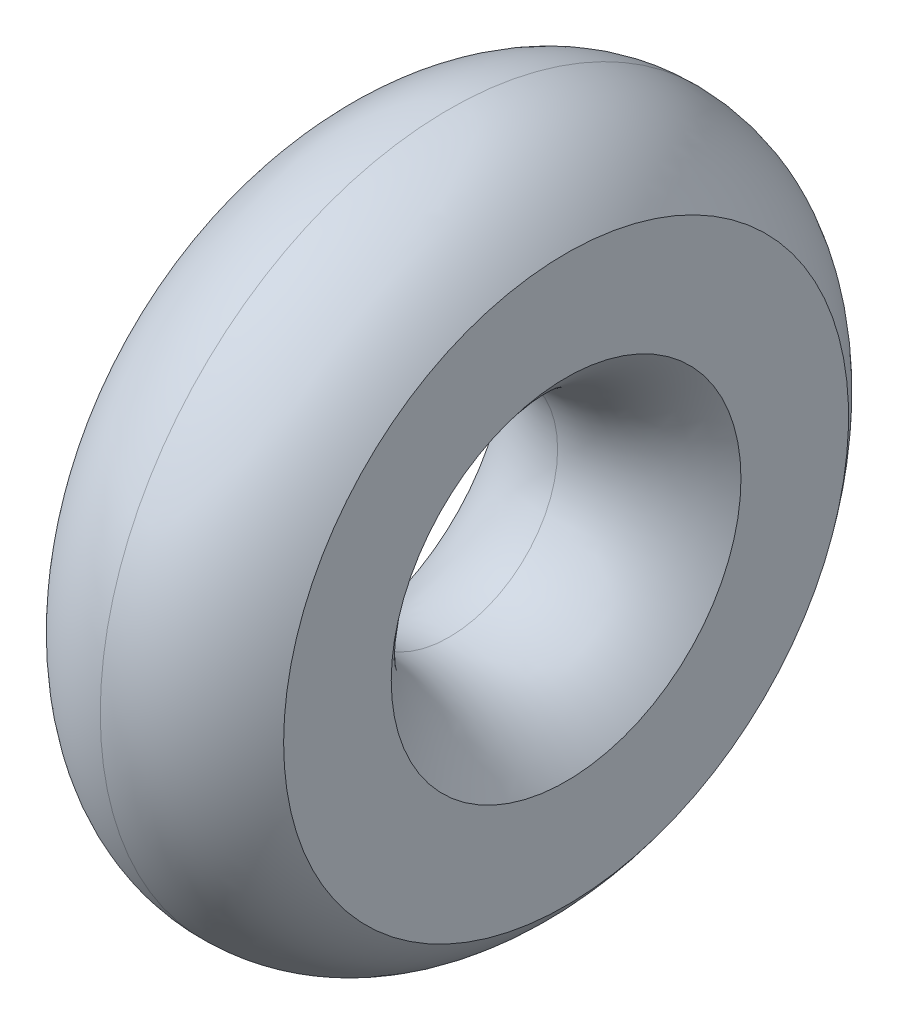
ISO-10303-21;
HEADER;
FILE_DESCRIPTION(('STEP AP214'),'2;1');
FILE_NAME('part.step','',(''),(''),'','','');
FILE_SCHEMA(('AUTOMOTIVE_DESIGN { 1 0 10303 214 1 1 1 1 }'));
ENDSEC;
DATA;
#1=APPLICATION_CONTEXT('core data for automotive mechanical design processes');
#2=APPLICATION_PROTOCOL_DEFINITION('international standard','automotive_design',2000,#1);
#3=PRODUCT_CONTEXT('',#1,'mechanical');
#4=PRODUCT('Part','Part','',(#3));
#5=PRODUCT_RELATED_PRODUCT_CATEGORY('part','',(#4));
#6=PRODUCT_DEFINITION_FORMATION('','',#4);
#7=PRODUCT_DEFINITION_CONTEXT('part definition',#1,'design');
#8=PRODUCT_DEFINITION('design','',#6,#7);
#9=PRODUCT_DEFINITION_SHAPE('','',#8);
#10=(LENGTH_UNIT() NAMED_UNIT(*) SI_UNIT(.MILLI.,.METRE.));
#11=(NAMED_UNIT(*) PLANE_ANGLE_UNIT() SI_UNIT($,.RADIAN.));
#12=(NAMED_UNIT(*) SI_UNIT($,.STERADIAN.) SOLID_ANGLE_UNIT());
#13=UNCERTAINTY_MEASURE_WITH_UNIT(LENGTH_MEASURE(1.E-05),#10,'distance_accuracy_value','');
#14=(GEOMETRIC_REPRESENTATION_CONTEXT(3) GLOBAL_UNCERTAINTY_ASSIGNED_CONTEXT((#13)) GLOBAL_UNIT_ASSIGNED_CONTEXT((#10,
#11,#12)) REPRESENTATION_CONTEXT('',''));
#15=CARTESIAN_POINT('',(0.,0.,0.));
#16=DIRECTION('',(0.,0.,1.));
#17=DIRECTION('',(1.,0.,0.));
#18=AXIS2_PLACEMENT_3D('',#15,#16,#17);
#19=CARTESIAN_POINT('',(61.6003442434204,64.6910032824228,-6.33041028003398));
#20=CARTESIAN_POINT('',(43.1064025163603,40.1449744833965,-3.92843125421809));
#21=CARTESIAN_POINT('',(18.1064025163603,40.1449744833965,-3.92843125421809));
#22=B_SPLINE_CURVE_WITH_KNOTS('',2,(#19,#20,#21),.UNSPECIFIED.,.F.,.F.,(3,3),(0.,1.),.UNSPECIFIED.);
#23=CARTESIAN_POINT('',(-55.9759649864125,0.,0.));
#24=DIRECTION('',(-1.,0.,0.));
#25=AXIS1_PLACEMENT('',#23,#24);
#26=SURFACE_OF_REVOLUTION('',#22,#25);
#27=CARTESIAN_POINT('',(18.1064025163603,0.,0.));
#28=DIRECTION('',(-1.,0.,0.));
#29=DIRECTION('',(0.,0.,1.));
#30=AXIS2_PLACEMENT_3D('',#27,#28,#29);
#31=CIRCLE('',#30,40.3367270411429);
#32=CARTESIAN_POINT('',(18.1064025163603,0.,40.3367270411429));
#33=VERTEX_POINT('',#32);
#34=EDGE_CURVE('E60',#33,#33,#31,.T.);
#35=ORIENTED_EDGE('',*,*,#34,.T.);
#36=EDGE_LOOP('',(#35));
#37=FACE_BOUND('',#36,.T.);
#38=CARTESIAN_POINT('',(61.6003442434204,0.,0.));
#39=DIRECTION('',(-1.,0.,0.));
#40=DIRECTION('',(0.,0.,1.));
#41=AXIS2_PLACEMENT_3D('',#38,#39,#40);
#42=CIRCLE('',#41,65.);
#43=CARTESIAN_POINT('',(61.6003442434204,0.,65.));
#44=VERTEX_POINT('',#43);
#45=EDGE_CURVE('E10',#44,#44,#42,.T.);
#46=ORIENTED_EDGE('',*,*,#45,.F.);
#47=EDGE_LOOP('',(#46));
#48=FACE_BOUND('',#47,.T.);
#49=ADVANCED_FACE('F37',(#37,#48),#26,.F.);
#50=CARTESIAN_POINT('',(61.6003442434204,104.500851456222,-10.2260473754395));
#51=DIRECTION('',(1.,0.,0.));
#52=DIRECTION('',(0.,0.,-1.));
#53=AXIS2_PLACEMENT_3D('',#50,#51,#52);
#54=PLANE('',#53);
#55=ORIENTED_EDGE('',*,*,#45,.T.);
#56=EDGE_LOOP('',(#55));
#57=FACE_BOUND('',#56,.T.);
#58=CARTESIAN_POINT('',(61.6003442434204,0.,0.));
#59=DIRECTION('',(-1.,0.,0.));
#60=DIRECTION('',(0.,0.,1.));
#61=AXIS2_PLACEMENT_3D('',#58,#59,#60);
#62=CIRCLE('',#61,105.);
#63=CARTESIAN_POINT('',(61.6003442434204,0.,105.));
#64=VERTEX_POINT('',#63);
#65=EDGE_CURVE('E44',#64,#64,#62,.T.);
#66=ORIENTED_EDGE('',*,*,#65,.F.);
#67=EDGE_LOOP('',(#66));
#68=FACE_BOUND('',#67,.T.);
#69=ADVANCED_FACE('F79',(#57,#68),#54,.T.);
#70=CARTESIAN_POINT('',(18.1064025163603,129.046880255248,-12.6280264012554));
#71=CARTESIAN_POINT('',(43.1064025163603,129.046880255248,-12.6280264012554));
#72=CARTESIAN_POINT('',(61.6003442434204,104.500851456222,-10.2260473754395));
#73=B_SPLINE_CURVE_WITH_KNOTS('',2,(#70,#71,#72),.UNSPECIFIED.,.F.,.F.,(3,3),(0.,1.),.UNSPECIFIED.);
#74=CARTESIAN_POINT('',(-55.9759649864125,0.,0.));
#75=DIRECTION('',(-1.,0.,0.));
#76=AXIS1_PLACEMENT('',#74,#75);
#77=SURFACE_OF_REVOLUTION('',#73,#76);
#78=ORIENTED_EDGE('',*,*,#65,.T.);
#79=EDGE_LOOP('',(#78));
#80=FACE_BOUND('',#79,.T.);
#81=CARTESIAN_POINT('',(18.1064025163603,0.,0.));
#82=DIRECTION('',(-1.,0.,0.));
#83=DIRECTION('',(0.,0.,1.));
#84=AXIS2_PLACEMENT_3D('',#81,#82,#83);
#85=CIRCLE('',#84,129.663272958857);
#86=CARTESIAN_POINT('',(18.1064025163603,0.,129.663272958857));
#87=VERTEX_POINT('',#86);
#88=EDGE_CURVE('E48',#87,#87,#85,.T.);
#89=ORIENTED_EDGE('',*,*,#88,.F.);
#90=EDGE_LOOP('',(#89));
#91=FACE_BOUND('',#90,.T.);
#92=ADVANCED_FACE('F75',(#80,#91),#77,.F.);
#93=CARTESIAN_POINT('',(-25.3875392106996,104.500851456222,-10.2260473754395));
#94=CARTESIAN_POINT('',(-6.89359748363971,129.046880255248,-12.6280264012554));
#95=CARTESIAN_POINT('',(18.1064025163603,129.046880255248,-12.6280264012554));
#96=B_SPLINE_CURVE_WITH_KNOTS('',2,(#93,#94,#95),.UNSPECIFIED.,.F.,.F.,(3,3),(0.,1.),.UNSPECIFIED.);
#97=CARTESIAN_POINT('',(-55.9759649864125,0.,0.));
#98=DIRECTION('',(-1.,0.,0.));
#99=AXIS1_PLACEMENT('',#97,#98);
#100=SURFACE_OF_REVOLUTION('',#96,#99);
#101=ORIENTED_EDGE('',*,*,#88,.T.);
#102=EDGE_LOOP('',(#101));
#103=FACE_BOUND('',#102,.T.);
#104=CARTESIAN_POINT('',(-25.3875392106996,0.,0.));
#105=DIRECTION('',(-1.,0.,0.));
#106=DIRECTION('',(0.,0.,1.));
#107=AXIS2_PLACEMENT_3D('',#104,#105,#106);
#108=CIRCLE('',#107,105.);
#109=CARTESIAN_POINT('',(-25.3875392106996,0.,105.));
#110=VERTEX_POINT('',#109);
#111=EDGE_CURVE('E52',#110,#110,#108,.T.);
#112=ORIENTED_EDGE('',*,*,#111,.F.);
#113=EDGE_LOOP('',(#112));
#114=FACE_BOUND('',#113,.T.);
#115=ADVANCED_FACE('F78',(#103,#114),#100,.F.);
#116=CARTESIAN_POINT('',(-25.3875392106996,104.500851456222,-10.2260473754395));
#117=DIRECTION('',(-1.,0.,0.));
#118=DIRECTION('',(0.,0.,1.));
#119=AXIS2_PLACEMENT_3D('',#116,#117,#118);
#120=PLANE('',#119);
#121=ORIENTED_EDGE('',*,*,#111,.T.);
#122=EDGE_LOOP('',(#121));
#123=FACE_BOUND('',#122,.T.);
#124=CARTESIAN_POINT('',(-25.3875392106996,0.,0.));
#125=DIRECTION('',(-1.,0.,0.));
#126=DIRECTION('',(0.,0.,1.));
#127=AXIS2_PLACEMENT_3D('',#124,#125,#126);
#128=CIRCLE('',#127,65.);
#129=CARTESIAN_POINT('',(-25.3875392106996,0.,65.));
#130=VERTEX_POINT('',#129);
#131=EDGE_CURVE('E57',#130,#130,#128,.T.);
#132=ORIENTED_EDGE('',*,*,#131,.F.);
#133=EDGE_LOOP('',(#132));
#134=FACE_BOUND('',#133,.T.);
#135=ADVANCED_FACE('F94',(#123,#134),#120,.T.);
#136=CARTESIAN_POINT('',(18.1064025163603,40.1449744833965,-3.92843125421809));
#137=CARTESIAN_POINT('',(-6.89359748363971,40.1449744833965,-3.92843125421809));
#138=CARTESIAN_POINT('',(-25.3875392106996,64.6910032824228,-6.33041028003398));
#139=B_SPLINE_CURVE_WITH_KNOTS('',2,(#136,#137,#138),.UNSPECIFIED.,.F.,.F.,(3,3),(0.,1.),.UNSPECIFIED.);
#140=CARTESIAN_POINT('',(-55.9759649864125,0.,0.));
#141=DIRECTION('',(-1.,0.,0.));
#142=AXIS1_PLACEMENT('',#140,#141);
#143=SURFACE_OF_REVOLUTION('',#139,#142);
#144=ORIENTED_EDGE('',*,*,#131,.T.);
#145=EDGE_LOOP('',(#144));
#146=FACE_BOUND('',#145,.T.);
#147=ORIENTED_EDGE('',*,*,#34,.F.);
#148=EDGE_LOOP('',(#147));
#149=FACE_BOUND('',#148,.T.);
#150=ADVANCED_FACE('F92',(#146,#149),#143,.F.);
#151=CLOSED_SHELL('',(#49,#69,#92,#115,#135,#150));
#152=MANIFOLD_SOLID_BREP('B2',#151);
#153=ADVANCED_BREP_SHAPE_REPRESENTATION('',(#18,#152),#14);
#154=SHAPE_DEFINITION_REPRESENTATION(#9,#153);
ENDSEC;
END-ISO-10303-21;
